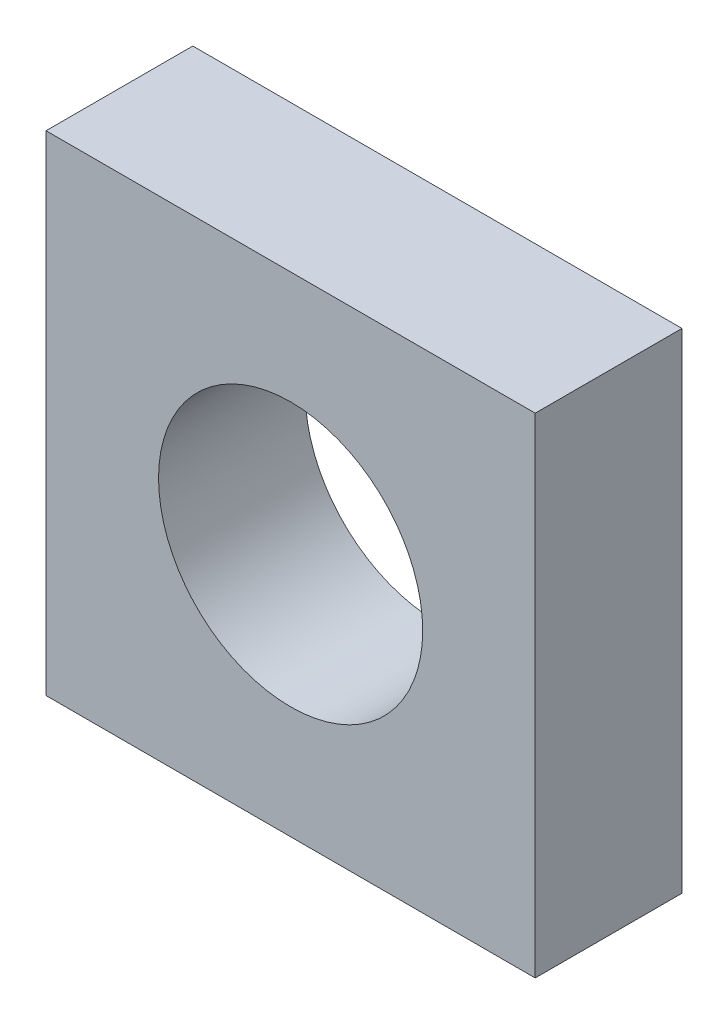
ISO-10303-21;
HEADER;
FILE_DESCRIPTION(('STEP AP214'),'2;1');
FILE_NAME('part.step','',(''),(''),'','','');
FILE_SCHEMA(('AUTOMOTIVE_DESIGN { 1 0 10303 214 1 1 1 1 }'));
ENDSEC;
DATA;
#1=APPLICATION_CONTEXT('core data for automotive mechanical design processes');
#2=APPLICATION_PROTOCOL_DEFINITION('international standard','automotive_design',2000,#1);
#3=PRODUCT_CONTEXT('',#1,'mechanical');
#4=PRODUCT('Part','Part','',(#3));
#5=PRODUCT_RELATED_PRODUCT_CATEGORY('part','',(#4));
#6=PRODUCT_DEFINITION_FORMATION('','',#4);
#7=PRODUCT_DEFINITION_CONTEXT('part definition',#1,'design');
#8=PRODUCT_DEFINITION('design','',#6,#7);
#9=PRODUCT_DEFINITION_SHAPE('','',#8);
#10=(LENGTH_UNIT() NAMED_UNIT(*) SI_UNIT(.MILLI.,.METRE.));
#11=(NAMED_UNIT(*) PLANE_ANGLE_UNIT() SI_UNIT($,.RADIAN.));
#12=(NAMED_UNIT(*) SI_UNIT($,.STERADIAN.) SOLID_ANGLE_UNIT());
#13=UNCERTAINTY_MEASURE_WITH_UNIT(LENGTH_MEASURE(1.E-05),#10,'distance_accuracy_value','');
#14=(GEOMETRIC_REPRESENTATION_CONTEXT(3) GLOBAL_UNCERTAINTY_ASSIGNED_CONTEXT((#13)) GLOBAL_UNIT_ASSIGNED_CONTEXT((#10,
#11,#12)) REPRESENTATION_CONTEXT('',''));
#15=CARTESIAN_POINT('',(0.,0.,0.));
#16=DIRECTION('',(0.,0.,1.));
#17=DIRECTION('',(1.,0.,0.));
#18=AXIS2_PLACEMENT_3D('',#15,#16,#17);
#19=CARTESIAN_POINT('',(0.,0.,4.5));
#20=DIRECTION('',(0.,0.,1.));
#21=DIRECTION('',(1.,0.,0.));
#22=AXIS2_PLACEMENT_3D('',#19,#20,#21);
#23=PLANE('',#22);
#24=DIRECTION('',(0.,1.,0.));
#25=VECTOR('',#24,1.);
#26=CARTESIAN_POINT('',(7.5,7.5,4.5));
#27=LINE('',#26,#25);
#28=CARTESIAN_POINT('',(7.5,-7.5,4.5));
#29=VERTEX_POINT('',#28);
#30=CARTESIAN_POINT('',(7.5,7.5,4.5));
#31=VERTEX_POINT('',#30);
#32=EDGE_CURVE('E92',#29,#31,#27,.T.);
#33=ORIENTED_EDGE('',*,*,#32,.T.);
#34=DIRECTION('',(-1.,0.,0.));
#35=VECTOR('',#34,1.);
#36=CARTESIAN_POINT('',(-7.5,7.5,4.5));
#37=LINE('',#36,#35);
#38=CARTESIAN_POINT('',(-7.5,7.5,4.5));
#39=VERTEX_POINT('',#38);
#40=EDGE_CURVE('E87',#31,#39,#37,.T.);
#41=ORIENTED_EDGE('',*,*,#40,.T.);
#42=DIRECTION('',(0.,-1.,0.));
#43=VECTOR('',#42,1.);
#44=CARTESIAN_POINT('',(-7.5,7.5,4.5));
#45=LINE('',#44,#43);
#46=CARTESIAN_POINT('',(-7.5,-7.5,4.5));
#47=VERTEX_POINT('',#46);
#48=EDGE_CURVE('E90',#39,#47,#45,.T.);
#49=ORIENTED_EDGE('',*,*,#48,.T.);
#50=DIRECTION('',(1.,0.,0.));
#51=VECTOR('',#50,1.);
#52=CARTESIAN_POINT('',(-7.5,-7.5,4.5));
#53=LINE('',#52,#51);
#54=EDGE_CURVE('E57',#47,#29,#53,.T.);
#55=ORIENTED_EDGE('',*,*,#54,.T.);
#56=EDGE_LOOP('',(#33,#41,#49,#55));
#57=FACE_BOUND('',#56,.T.);
#58=CARTESIAN_POINT('',(0.,0.,4.5));
#59=DIRECTION('',(0.,0.,1.));
#60=DIRECTION('',(1.,0.,0.));
#61=AXIS2_PLACEMENT_3D('',#58,#59,#60);
#62=CIRCLE('',#61,4.05);
#63=CARTESIAN_POINT('',(4.05,0.,4.5));
#64=VERTEX_POINT('',#63);
#65=EDGE_CURVE('E112',#64,#64,#62,.T.);
#66=ORIENTED_EDGE('',*,*,#65,.F.);
#67=EDGE_LOOP('',(#66));
#68=FACE_BOUND('',#67,.T.);
#69=ADVANCED_FACE('F39',(#57,#68),#23,.T.);
#70=CARTESIAN_POINT('',(0.,0.,0.));
#71=DIRECTION('',(0.,0.,1.));
#72=DIRECTION('',(1.,0.,0.));
#73=AXIS2_PLACEMENT_3D('',#70,#71,#72);
#74=PLANE('',#73);
#75=DIRECTION('',(0.,1.,0.));
#76=VECTOR('',#75,1.);
#77=CARTESIAN_POINT('',(7.5,7.5,0.));
#78=LINE('',#77,#76);
#79=CARTESIAN_POINT('',(7.5,-7.5,0.));
#80=VERTEX_POINT('',#79);
#81=CARTESIAN_POINT('',(7.5,7.5,0.));
#82=VERTEX_POINT('',#81);
#83=EDGE_CURVE('E108',#80,#82,#78,.T.);
#84=ORIENTED_EDGE('',*,*,#83,.F.);
#85=DIRECTION('',(1.,0.,0.));
#86=VECTOR('',#85,1.);
#87=CARTESIAN_POINT('',(-7.5,-7.5,0.));
#88=LINE('',#87,#86);
#89=CARTESIAN_POINT('',(-7.5,-7.5,0.));
#90=VERTEX_POINT('',#89);
#91=EDGE_CURVE('E80',#90,#80,#88,.T.);
#92=ORIENTED_EDGE('',*,*,#91,.F.);
#93=DIRECTION('',(0.,-1.,0.));
#94=VECTOR('',#93,1.);
#95=CARTESIAN_POINT('',(-7.5,7.5,0.));
#96=LINE('',#95,#94);
#97=CARTESIAN_POINT('',(-7.5,7.5,0.));
#98=VERTEX_POINT('',#97);
#99=EDGE_CURVE('E74',#98,#90,#96,.T.);
#100=ORIENTED_EDGE('',*,*,#99,.F.);
#101=DIRECTION('',(-1.,0.,0.));
#102=VECTOR('',#101,1.);
#103=CARTESIAN_POINT('',(-7.5,7.5,0.));
#104=LINE('',#103,#102);
#105=EDGE_CURVE('E97',#82,#98,#104,.T.);
#106=ORIENTED_EDGE('',*,*,#105,.F.);
#107=EDGE_LOOP('',(#84,#92,#100,#106));
#108=FACE_BOUND('',#107,.T.);
#109=CARTESIAN_POINT('',(0.,0.,0.));
#110=DIRECTION('',(0.,0.,1.));
#111=DIRECTION('',(1.,0.,0.));
#112=AXIS2_PLACEMENT_3D('',#109,#110,#111);
#113=CIRCLE('',#112,4.05);
#114=CARTESIAN_POINT('',(4.05,0.,0.));
#115=VERTEX_POINT('',#114);
#116=EDGE_CURVE('E130',#115,#115,#113,.T.);
#117=ORIENTED_EDGE('',*,*,#116,.T.);
#118=EDGE_LOOP('',(#117));
#119=FACE_BOUND('',#118,.T.);
#120=ADVANCED_FACE('F125',(#108,#119),#74,.F.);
#121=CARTESIAN_POINT('',(7.5,7.5,4.5));
#122=DIRECTION('',(-1.,0.,0.));
#123=DIRECTION('',(0.,-1.,0.));
#124=AXIS2_PLACEMENT_3D('',#121,#122,#123);
#125=PLANE('',#124);
#126=ORIENTED_EDGE('',*,*,#83,.T.);
#127=DIRECTION('',(0.,0.,-1.));
#128=VECTOR('',#127,1.);
#129=CARTESIAN_POINT('',(7.5,7.5,4.5));
#130=LINE('',#129,#128);
#131=EDGE_CURVE('E11',#31,#82,#130,.T.);
#132=ORIENTED_EDGE('',*,*,#131,.F.);
#133=ORIENTED_EDGE('',*,*,#32,.F.);
#134=DIRECTION('',(0.,0.,-1.));
#135=VECTOR('',#134,1.);
#136=CARTESIAN_POINT('',(7.5,-7.5,4.5));
#137=LINE('',#136,#135);
#138=EDGE_CURVE('E104',#29,#80,#137,.T.);
#139=ORIENTED_EDGE('',*,*,#138,.T.);
#140=EDGE_LOOP('',(#126,#132,#133,#139));
#141=FACE_BOUND('',#140,.T.);
#142=ADVANCED_FACE('F41',(#141),#125,.F.);
#143=CARTESIAN_POINT('',(-7.5,7.5,4.5));
#144=DIRECTION('',(0.,-1.,0.));
#145=DIRECTION('',(0.,0.,-1.));
#146=AXIS2_PLACEMENT_3D('',#143,#144,#145);
#147=PLANE('',#146);
#148=ORIENTED_EDGE('',*,*,#105,.T.);
#149=DIRECTION('',(0.,0.,-1.));
#150=VECTOR('',#149,1.);
#151=CARTESIAN_POINT('',(-7.5,7.5,4.5));
#152=LINE('',#151,#150);
#153=EDGE_CURVE('E49',#39,#98,#152,.T.);
#154=ORIENTED_EDGE('',*,*,#153,.F.);
#155=ORIENTED_EDGE('',*,*,#40,.F.);
#156=ORIENTED_EDGE('',*,*,#131,.T.);
#157=EDGE_LOOP('',(#148,#154,#155,#156));
#158=FACE_BOUND('',#157,.T.);
#159=ADVANCED_FACE('F96',(#158),#147,.F.);
#160=CARTESIAN_POINT('',(-7.5,7.5,4.5));
#161=DIRECTION('',(1.,0.,0.));
#162=DIRECTION('',(0.,1.,0.));
#163=AXIS2_PLACEMENT_3D('',#160,#161,#162);
#164=PLANE('',#163);
#165=ORIENTED_EDGE('',*,*,#99,.T.);
#166=DIRECTION('',(0.,0.,-1.));
#167=VECTOR('',#166,1.);
#168=CARTESIAN_POINT('',(-7.5,-7.5,4.5));
#169=LINE('',#168,#167);
#170=EDGE_CURVE('E99',#47,#90,#169,.T.);
#171=ORIENTED_EDGE('',*,*,#170,.F.);
#172=ORIENTED_EDGE('',*,*,#48,.F.);
#173=ORIENTED_EDGE('',*,*,#153,.T.);
#174=EDGE_LOOP('',(#165,#171,#172,#173));
#175=FACE_BOUND('',#174,.T.);
#176=ADVANCED_FACE('F100',(#175),#164,.F.);
#177=CARTESIAN_POINT('',(-7.5,-7.5,4.5));
#178=DIRECTION('',(0.,1.,0.));
#179=DIRECTION('',(-1.,0.,0.));
#180=AXIS2_PLACEMENT_3D('',#177,#178,#179);
#181=PLANE('',#180);
#182=ORIENTED_EDGE('',*,*,#91,.T.);
#183=ORIENTED_EDGE('',*,*,#138,.F.);
#184=ORIENTED_EDGE('',*,*,#54,.F.);
#185=ORIENTED_EDGE('',*,*,#170,.T.);
#186=EDGE_LOOP('',(#182,#183,#184,#185));
#187=FACE_BOUND('',#186,.T.);
#188=ADVANCED_FACE('F122',(#187),#181,.F.);
#189=CARTESIAN_POINT('',(0.,0.,4.5));
#190=DIRECTION('',(0.,0.,-1.));
#191=DIRECTION('',(-1.,0.,0.));
#192=AXIS2_PLACEMENT_3D('',#189,#190,#191);
#193=CYLINDRICAL_SURFACE('',#192,4.05);
#194=ORIENTED_EDGE('',*,*,#65,.T.);
#195=EDGE_LOOP('',(#194));
#196=FACE_BOUND('',#195,.T.);
#197=ORIENTED_EDGE('',*,*,#116,.F.);
#198=EDGE_LOOP('',(#197));
#199=FACE_BOUND('',#198,.T.);
#200=ADVANCED_FACE('F138',(#196,#199),#193,.F.);
#201=CLOSED_SHELL('',(#69,#120,#142,#159,#176,#188,#200));
#202=MANIFOLD_SOLID_BREP('B2',#201);
#203=ADVANCED_BREP_SHAPE_REPRESENTATION('',(#18,#202),#14);
#204=SHAPE_DEFINITION_REPRESENTATION(#9,#203);
ENDSEC;
END-ISO-10303-21;
